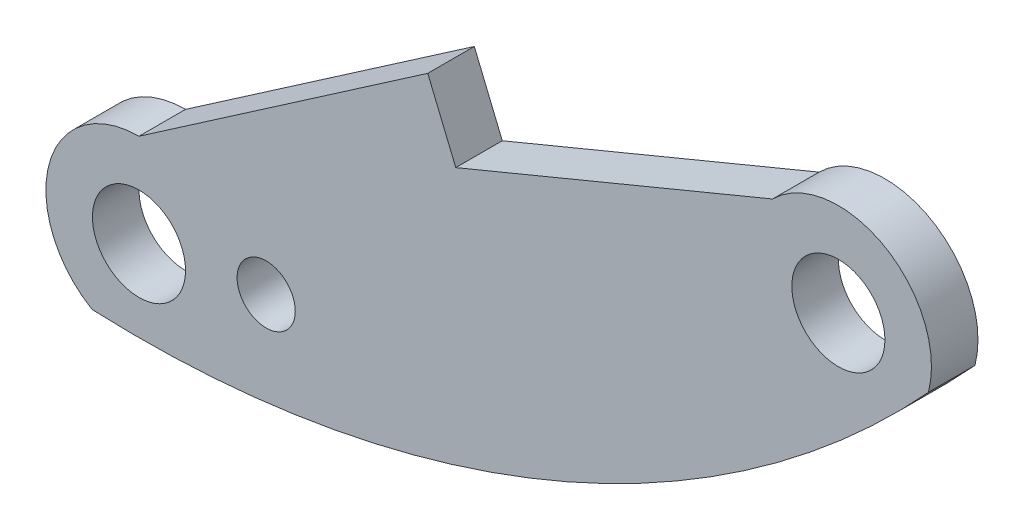
ISO-10303-21;
HEADER;
FILE_DESCRIPTION(('STEP AP214'),'2;1');
FILE_NAME('part.step','',(''),(''),'','','');
FILE_SCHEMA(('AUTOMOTIVE_DESIGN { 1 0 10303 214 1 1 1 1 }'));
ENDSEC;
DATA;
#1=APPLICATION_CONTEXT('core data for automotive mechanical design processes');
#2=APPLICATION_PROTOCOL_DEFINITION('international standard','automotive_design',2000,#1);
#3=PRODUCT_CONTEXT('',#1,'mechanical');
#4=PRODUCT('Part','Part','',(#3));
#5=PRODUCT_RELATED_PRODUCT_CATEGORY('part','',(#4));
#6=PRODUCT_DEFINITION_FORMATION('','',#4);
#7=PRODUCT_DEFINITION_CONTEXT('part definition',#1,'design');
#8=PRODUCT_DEFINITION('design','',#6,#7);
#9=PRODUCT_DEFINITION_SHAPE('','',#8);
#10=(LENGTH_UNIT() NAMED_UNIT(*) SI_UNIT(.MILLI.,.METRE.));
#11=(NAMED_UNIT(*) PLANE_ANGLE_UNIT() SI_UNIT($,.RADIAN.));
#12=(NAMED_UNIT(*) SI_UNIT($,.STERADIAN.) SOLID_ANGLE_UNIT());
#13=UNCERTAINTY_MEASURE_WITH_UNIT(LENGTH_MEASURE(1.E-05),#10,'distance_accuracy_value','');
#14=(GEOMETRIC_REPRESENTATION_CONTEXT(3) GLOBAL_UNCERTAINTY_ASSIGNED_CONTEXT((#13)) GLOBAL_UNIT_ASSIGNED_CONTEXT((#10,
#11,#12)) REPRESENTATION_CONTEXT('',''));
#15=CARTESIAN_POINT('',(0.,0.,0.));
#16=DIRECTION('',(0.,0.,1.));
#17=DIRECTION('',(1.,0.,0.));
#18=AXIS2_PLACEMENT_3D('',#15,#16,#17);
#19=CARTESIAN_POINT('',(0.259047619047603,0.870476190476306,2.));
#20=DIRECTION('',(0.,0.,-1.));
#21=DIRECTION('',(-1.,0.,0.));
#22=AXIS2_PLACEMENT_3D('',#19,#20,#21);
#23=CYLINDRICAL_SURFACE('',#22,45.9999999999994);
#24=CARTESIAN_POINT('',(0.259047619047603,0.870476190476306,0.));
#25=DIRECTION('',(0.,0.,1.));
#26=DIRECTION('',(1.,0.,0.));
#27=AXIS2_PLACEMENT_3D('',#24,#25,#26);
#28=CIRCLE('',#27,45.9999999999994);
#29=CARTESIAN_POINT('',(34.1789962951553,-30.2010072277668,0.));
#30=VERTEX_POINT('',#29);
#31=CARTESIAN_POINT('',(-1.7551214807608,-45.0854061624645,0.));
#32=VERTEX_POINT('',#31);
#33=EDGE_CURVE('E135',#30,#32,#28,.F.);
#34=ORIENTED_EDGE('',*,*,#33,.F.);
#35=DIRECTION('',(0.,0.,-1.));
#36=VECTOR('',#35,1.);
#37=CARTESIAN_POINT('',(34.1789962951553,-30.2010072277668,2.));
#38=LINE('',#37,#36);
#39=CARTESIAN_POINT('',(34.1789962951553,-30.2010072277668,2.));
#40=VERTEX_POINT('',#39);
#41=EDGE_CURVE('E11',#40,#30,#38,.T.);
#42=ORIENTED_EDGE('',*,*,#41,.F.);
#43=CARTESIAN_POINT('',(0.259047619047603,0.870476190476306,2.));
#44=DIRECTION('',(0.,0.,1.));
#45=DIRECTION('',(1.,0.,0.));
#46=AXIS2_PLACEMENT_3D('',#43,#44,#45);
#47=CIRCLE('',#46,45.9999999999994);
#48=CARTESIAN_POINT('',(-1.7551214807608,-45.0854061624645,2.));
#49=VERTEX_POINT('',#48);
#50=EDGE_CURVE('E199',#40,#49,#47,.F.);
#51=ORIENTED_EDGE('',*,*,#50,.T.);
#52=DIRECTION('',(0.,0.,-1.));
#53=VECTOR('',#52,1.);
#54=CARTESIAN_POINT('',(-1.7551214807608,-45.0854061624645,2.));
#55=LINE('',#54,#53);
#56=EDGE_CURVE('E81',#49,#32,#55,.T.);
#57=ORIENTED_EDGE('',*,*,#56,.T.);
#58=EDGE_LOOP('',(#34,#42,#51,#57));
#59=FACE_BOUND('',#58,.T.);
#60=ADVANCED_FACE('F36',(#59),#23,.T.);
#61=CARTESIAN_POINT('',(30.3110858194759,-29.1815620099521,2.));
#62=DIRECTION('',(0.,0.,-1.));
#63=DIRECTION('',(-1.,0.,0.));
#64=AXIS2_PLACEMENT_3D('',#61,#62,#63);
#65=CYLINDRICAL_SURFACE('',#64,3.99999999999944);
#66=CARTESIAN_POINT('',(30.3110858194759,-29.1815620099521,0.));
#67=DIRECTION('',(0.,0.,1.));
#68=DIRECTION('',(1.,0.,0.));
#69=AXIS2_PLACEMENT_3D('',#66,#67,#68);
#70=CIRCLE('',#69,3.99999999999944);
#71=CARTESIAN_POINT('',(27.4826586947299,-26.3531348852058,0.));
#72=VERTEX_POINT('',#71);
#73=EDGE_CURVE('E132',#72,#30,#70,.F.);
#74=ORIENTED_EDGE('',*,*,#73,.F.);
#75=DIRECTION('',(0.,0.,-1.));
#76=VECTOR('',#75,1.);
#77=CARTESIAN_POINT('',(27.4826586947299,-26.3531348852058,2.));
#78=LINE('',#77,#76);
#79=CARTESIAN_POINT('',(27.4826586947299,-26.3531348852058,2.));
#80=VERTEX_POINT('',#79);
#81=EDGE_CURVE('E45',#80,#72,#78,.T.);
#82=ORIENTED_EDGE('',*,*,#81,.F.);
#83=CARTESIAN_POINT('',(30.3110858194759,-29.1815620099521,2.));
#84=DIRECTION('',(0.,0.,1.));
#85=DIRECTION('',(1.,0.,0.));
#86=AXIS2_PLACEMENT_3D('',#83,#84,#85);
#87=CIRCLE('',#86,3.99999999999944);
#88=EDGE_CURVE('E201',#80,#40,#87,.F.);
#89=ORIENTED_EDGE('',*,*,#88,.T.);
#90=ORIENTED_EDGE('',*,*,#41,.T.);
#91=EDGE_LOOP('',(#74,#82,#89,#90));
#92=FACE_BOUND('',#91,.T.);
#93=ADVANCED_FACE('F134',(#92),#65,.T.);
#94=CARTESIAN_POINT('',(13.3419823747506,-32.2103947980687,2.));
#95=DIRECTION('',(0.382683432365059,-0.923879532511299,0.));
#96=DIRECTION('',(0.923879532511299,0.382683432365059,0.));
#97=AXIS2_PLACEMENT_3D('',#94,#95,#96);
#98=PLANE('',#97);
#99=DIRECTION('',(-0.9238795325113,-0.382683432365059,0.));
#100=VECTOR('',#99,1.);
#101=CARTESIAN_POINT('',(13.3419823747506,-32.2103947980687,0.));
#102=LINE('',#101,#100);
#103=CARTESIAN_POINT('',(13.8708531568888,-31.9913293473643,0.));
#104=VERTEX_POINT('',#103);
#105=EDGE_CURVE('E125',#72,#104,#102,.T.);
#106=ORIENTED_EDGE('',*,*,#105,.T.);
#107=DIRECTION('',(0.,0.,-1.));
#108=VECTOR('',#107,1.);
#109=CARTESIAN_POINT('',(13.8708531568888,-31.9913293473643,2.));
#110=LINE('',#109,#108);
#111=CARTESIAN_POINT('',(13.8708531568888,-31.9913293473643,2.));
#112=VERTEX_POINT('',#111);
#113=EDGE_CURVE('E116',#112,#104,#110,.T.);
#114=ORIENTED_EDGE('',*,*,#113,.F.);
#115=DIRECTION('',(-0.9238795325113,-0.382683432365059,0.));
#116=VECTOR('',#115,1.);
#117=CARTESIAN_POINT('',(13.3419823747506,-32.2103947980687,2.));
#118=LINE('',#117,#116);
#119=EDGE_CURVE('E109',#80,#112,#118,.T.);
#120=ORIENTED_EDGE('',*,*,#119,.F.);
#121=ORIENTED_EDGE('',*,*,#81,.T.);
#122=EDGE_LOOP('',(#106,#114,#120,#121));
#123=FACE_BOUND('',#122,.T.);
#124=ADVANCED_FACE('F124',(#123),#98,.F.);
#125=CARTESIAN_POINT('',(0.528870782138126,0.219065450704458,2.));
#126=DIRECTION('',(-0.923879532511299,-0.38268343236506,0.));
#127=DIRECTION('',(0.38268343236506,-0.923879532511299,0.));
#128=AXIS2_PLACEMENT_3D('',#125,#126,#127);
#129=PLANE('',#128);
#130=DIRECTION('',(-0.38268343236506,0.923879532511299,0.));
#131=VECTOR('',#130,1.);
#132=CARTESIAN_POINT('',(0.528870782138126,0.219065450704458,0.));
#133=LINE('',#132,#131);
#134=CARTESIAN_POINT('',(12.667014151924,-29.0850048946643,0.));
#135=VERTEX_POINT('',#134);
#136=EDGE_CURVE('E115',#104,#135,#133,.T.);
#137=ORIENTED_EDGE('',*,*,#136,.T.);
#138=DIRECTION('',(0.,0.,-1.));
#139=VECTOR('',#138,1.);
#140=CARTESIAN_POINT('',(12.667014151924,-29.0850048946643,2.));
#141=LINE('',#140,#139);
#142=CARTESIAN_POINT('',(12.667014151924,-29.0850048946643,2.));
#143=VERTEX_POINT('',#142);
#144=EDGE_CURVE('E99',#143,#135,#141,.T.);
#145=ORIENTED_EDGE('',*,*,#144,.F.);
#146=DIRECTION('',(-0.38268343236506,0.923879532511299,0.));
#147=VECTOR('',#146,1.);
#148=CARTESIAN_POINT('',(0.528870782138126,0.219065450704458,2.));
#149=LINE('',#148,#147);
#150=EDGE_CURVE('E102',#112,#143,#149,.T.);
#151=ORIENTED_EDGE('',*,*,#150,.F.);
#152=ORIENTED_EDGE('',*,*,#113,.T.);
#153=EDGE_LOOP('',(#137,#145,#151,#152));
#154=FACE_BOUND('',#153,.T.);
#155=ADVANCED_FACE('F114',(#154),#129,.F.);
#156=CARTESIAN_POINT('',(17.6607557738018,-25.646156181541,2.));
#157=DIRECTION('',(0.567161569341394,-0.823606553071433,0.));
#158=DIRECTION('',(0.823606553071433,0.567161569341394,0.));
#159=AXIS2_PLACEMENT_3D('',#156,#157,#158);
#160=PLANE('',#159);
#161=DIRECTION('',(-0.823606553071433,-0.567161569341394,0.));
#162=VECTOR('',#161,1.);
#163=CARTESIAN_POINT('',(17.6607557738018,-25.646156181541,0.));
#164=LINE('',#163,#162);
#165=CARTESIAN_POINT('',(0.259047619049199,-37.6295238095234,0.));
#166=VERTEX_POINT('',#165);
#167=EDGE_CURVE('E142',#135,#166,#164,.T.);
#168=ORIENTED_EDGE('',*,*,#167,.T.);
#169=DIRECTION('',(0.,0.,-1.));
#170=VECTOR('',#169,1.);
#171=CARTESIAN_POINT('',(0.259047619049199,-37.6295238095234,2.));
#172=LINE('',#171,#170);
#173=CARTESIAN_POINT('',(0.259047619049199,-37.6295238095234,2.));
#174=VERTEX_POINT('',#173);
#175=EDGE_CURVE('E101',#174,#166,#172,.T.);
#176=ORIENTED_EDGE('',*,*,#175,.F.);
#177=DIRECTION('',(-0.823606553071433,-0.567161569341394,0.));
#178=VECTOR('',#177,1.);
#179=CARTESIAN_POINT('',(17.6607557738018,-25.646156181541,2.));
#180=LINE('',#179,#178);
#181=EDGE_CURVE('E94',#143,#174,#180,.T.);
#182=ORIENTED_EDGE('',*,*,#181,.F.);
#183=ORIENTED_EDGE('',*,*,#144,.T.);
#184=EDGE_LOOP('',(#168,#176,#182,#183));
#185=FACE_BOUND('',#184,.T.);
#186=ADVANCED_FACE('F97',(#185),#160,.F.);
#187=CARTESIAN_POINT('',(30.3110858194759,-29.1815620099521,2.));
#188=DIRECTION('',(0.,0.,-1.));
#189=DIRECTION('',(-1.,0.,0.));
#190=AXIS2_PLACEMENT_3D('',#187,#188,#189);
#191=CYLINDRICAL_SURFACE('',#190,2.);
#192=CARTESIAN_POINT('',(30.3110858194759,-29.1815620099521,2.));
#193=DIRECTION('',(0.,0.,1.));
#194=DIRECTION('',(1.,0.,0.));
#195=AXIS2_PLACEMENT_3D('',#192,#193,#194);
#196=CIRCLE('',#195,2.);
#197=CARTESIAN_POINT('',(32.3110858194759,-29.1815620099521,2.));
#198=VERTEX_POINT('',#197);
#199=EDGE_CURVE('E153',#198,#198,#196,.T.);
#200=ORIENTED_EDGE('',*,*,#199,.T.);
#201=EDGE_LOOP('',(#200));
#202=FACE_BOUND('',#201,.T.);
#203=CARTESIAN_POINT('',(30.3110858194759,-29.1815620099521,0.));
#204=DIRECTION('',(0.,0.,1.));
#205=DIRECTION('',(1.,0.,0.));
#206=AXIS2_PLACEMENT_3D('',#203,#204,#205);
#207=CIRCLE('',#206,2.);
#208=CARTESIAN_POINT('',(32.3110858194759,-29.1815620099521,0.));
#209=VERTEX_POINT('',#208);
#210=EDGE_CURVE('E145',#209,#209,#207,.T.);
#211=ORIENTED_EDGE('',*,*,#210,.F.);
#212=EDGE_LOOP('',(#211));
#213=FACE_BOUND('',#212,.T.);
#214=ADVANCED_FACE('F173',(#202,#213),#191,.F.);
#215=CARTESIAN_POINT('',(0.259047619047603,-41.6295238095227,2.));
#216=DIRECTION('',(0.,0.,-1.));
#217=DIRECTION('',(-1.,0.,0.));
#218=AXIS2_PLACEMENT_3D('',#215,#216,#217);
#219=CYLINDRICAL_SURFACE('',#218,3.99999999999972);
#220=CARTESIAN_POINT('',(0.259047619047603,-41.6295238095227,0.));
#221=DIRECTION('',(0.,0.,1.));
#222=DIRECTION('',(1.,0.,0.));
#223=AXIS2_PLACEMENT_3D('',#220,#221,#222);
#224=CIRCLE('',#223,3.99999999999972);
#225=EDGE_CURVE('E74',#166,#32,#224,.T.);
#226=ORIENTED_EDGE('',*,*,#225,.T.);
#227=ORIENTED_EDGE('',*,*,#56,.F.);
#228=CARTESIAN_POINT('',(0.259047619047603,-41.6295238095227,2.));
#229=DIRECTION('',(0.,0.,1.));
#230=DIRECTION('',(1.,0.,0.));
#231=AXIS2_PLACEMENT_3D('',#228,#229,#230);
#232=CIRCLE('',#231,3.99999999999972);
#233=EDGE_CURVE('E53',#174,#49,#232,.T.);
#234=ORIENTED_EDGE('',*,*,#233,.F.);
#235=ORIENTED_EDGE('',*,*,#175,.T.);
#236=EDGE_LOOP('',(#226,#227,#234,#235));
#237=FACE_BOUND('',#236,.T.);
#238=ADVANCED_FACE('F166',(#237),#219,.T.);
#239=CARTESIAN_POINT('',(5.72400427634296,-40.7831800105128,2.));
#240=DIRECTION('',(0.,0.,-1.));
#241=DIRECTION('',(-1.,0.,0.));
#242=AXIS2_PLACEMENT_3D('',#239,#240,#241);
#243=CYLINDRICAL_SURFACE('',#242,1.24999999998678);
#244=CARTESIAN_POINT('',(5.72400427634296,-40.7831800105128,2.));
#245=DIRECTION('',(0.,0.,1.));
#246=DIRECTION('',(1.,0.,0.));
#247=AXIS2_PLACEMENT_3D('',#244,#245,#246);
#248=CIRCLE('',#247,1.24999999998678);
#249=CARTESIAN_POINT('',(6.97400427632975,-40.7831800105128,2.));
#250=VERTEX_POINT('',#249);
#251=EDGE_CURVE('E150',#250,#250,#248,.T.);
#252=ORIENTED_EDGE('',*,*,#251,.T.);
#253=EDGE_LOOP('',(#252));
#254=FACE_BOUND('',#253,.T.);
#255=CARTESIAN_POINT('',(5.72400427634296,-40.7831800105128,0.));
#256=DIRECTION('',(0.,0.,1.));
#257=DIRECTION('',(1.,0.,0.));
#258=AXIS2_PLACEMENT_3D('',#255,#256,#257);
#259=CIRCLE('',#258,1.24999999998678);
#260=CARTESIAN_POINT('',(6.97400427632975,-40.7831800105128,0.));
#261=VERTEX_POINT('',#260);
#262=EDGE_CURVE('E137',#261,#261,#259,.T.);
#263=ORIENTED_EDGE('',*,*,#262,.F.);
#264=EDGE_LOOP('',(#263));
#265=FACE_BOUND('',#264,.T.);
#266=ADVANCED_FACE('F38',(#254,#265),#243,.F.);
#267=CARTESIAN_POINT('',(0.259047619047603,-41.6295238095227,2.));
#268=DIRECTION('',(0.,0.,-1.));
#269=DIRECTION('',(-1.,0.,0.));
#270=AXIS2_PLACEMENT_3D('',#267,#268,#269);
#271=CYLINDRICAL_SURFACE('',#270,1.99999999999966);
#272=CARTESIAN_POINT('',(0.259047619047603,-41.6295238095227,2.));
#273=DIRECTION('',(0.,0.,1.));
#274=DIRECTION('',(1.,0.,0.));
#275=AXIS2_PLACEMENT_3D('',#272,#273,#274);
#276=CIRCLE('',#275,1.99999999999966);
#277=CARTESIAN_POINT('',(2.25904761904726,-41.6295238095227,2.));
#278=VERTEX_POINT('',#277);
#279=EDGE_CURVE('E151',#278,#278,#276,.T.);
#280=ORIENTED_EDGE('',*,*,#279,.T.);
#281=EDGE_LOOP('',(#280));
#282=FACE_BOUND('',#281,.T.);
#283=CARTESIAN_POINT('',(0.259047619047603,-41.6295238095227,0.));
#284=DIRECTION('',(0.,0.,1.));
#285=DIRECTION('',(1.,0.,0.));
#286=AXIS2_PLACEMENT_3D('',#283,#284,#285);
#287=CIRCLE('',#286,1.99999999999966);
#288=CARTESIAN_POINT('',(2.25904761904726,-41.6295238095227,0.));
#289=VERTEX_POINT('',#288);
#290=EDGE_CURVE('E148',#289,#289,#287,.T.);
#291=ORIENTED_EDGE('',*,*,#290,.F.);
#292=EDGE_LOOP('',(#291));
#293=FACE_BOUND('',#292,.T.);
#294=ADVANCED_FACE('F165',(#282,#293),#271,.F.);
#295=CARTESIAN_POINT('',(0.,0.,2.));
#296=DIRECTION('',(0.,0.,1.));
#297=DIRECTION('',(1.,0.,0.));
#298=AXIS2_PLACEMENT_3D('',#295,#296,#297);
#299=PLANE('',#298);
#300=ORIENTED_EDGE('',*,*,#251,.F.);
#301=EDGE_LOOP('',(#300));
#302=FACE_BOUND('',#301,.T.);
#303=ORIENTED_EDGE('',*,*,#50,.F.);
#304=ORIENTED_EDGE('',*,*,#88,.F.);
#305=ORIENTED_EDGE('',*,*,#119,.T.);
#306=ORIENTED_EDGE('',*,*,#150,.T.);
#307=ORIENTED_EDGE('',*,*,#181,.T.);
#308=ORIENTED_EDGE('',*,*,#233,.T.);
#309=EDGE_LOOP('',(#303,#304,#305,#306,#307,#308));
#310=FACE_BOUND('',#309,.T.);
#311=ORIENTED_EDGE('',*,*,#199,.F.);
#312=EDGE_LOOP('',(#311));
#313=FACE_BOUND('',#312,.T.);
#314=ORIENTED_EDGE('',*,*,#279,.F.);
#315=EDGE_LOOP('',(#314));
#316=FACE_BOUND('',#315,.T.);
#317=ADVANCED_FACE('F105',(#302,#310,#313,#316),#299,.T.);
#318=CARTESIAN_POINT('',(0.,0.,0.));
#319=DIRECTION('',(0.,0.,1.));
#320=DIRECTION('',(1.,0.,0.));
#321=AXIS2_PLACEMENT_3D('',#318,#319,#320);
#322=PLANE('',#321);
#323=ORIENTED_EDGE('',*,*,#262,.T.);
#324=EDGE_LOOP('',(#323));
#325=FACE_BOUND('',#324,.T.);
#326=ORIENTED_EDGE('',*,*,#33,.T.);
#327=ORIENTED_EDGE('',*,*,#225,.F.);
#328=ORIENTED_EDGE('',*,*,#167,.F.);
#329=ORIENTED_EDGE('',*,*,#136,.F.);
#330=ORIENTED_EDGE('',*,*,#105,.F.);
#331=ORIENTED_EDGE('',*,*,#73,.T.);
#332=EDGE_LOOP('',(#326,#327,#328,#329,#330,#331));
#333=FACE_BOUND('',#332,.T.);
#334=ORIENTED_EDGE('',*,*,#210,.T.);
#335=EDGE_LOOP('',(#334));
#336=FACE_BOUND('',#335,.T.);
#337=ORIENTED_EDGE('',*,*,#290,.T.);
#338=EDGE_LOOP('',(#337));
#339=FACE_BOUND('',#338,.T.);
#340=ADVANCED_FACE('F130',(#325,#333,#336,#339),#322,.F.);
#341=CLOSED_SHELL('',(#60,#93,#124,#155,#186,#214,#238,#266,#294,#317,#340));
#342=MANIFOLD_SOLID_BREP('B2',#341);
#343=ADVANCED_BREP_SHAPE_REPRESENTATION('',(#18,#342),#14);
#344=SHAPE_DEFINITION_REPRESENTATION(#9,#343);
ENDSEC;
END-ISO-10303-21;
